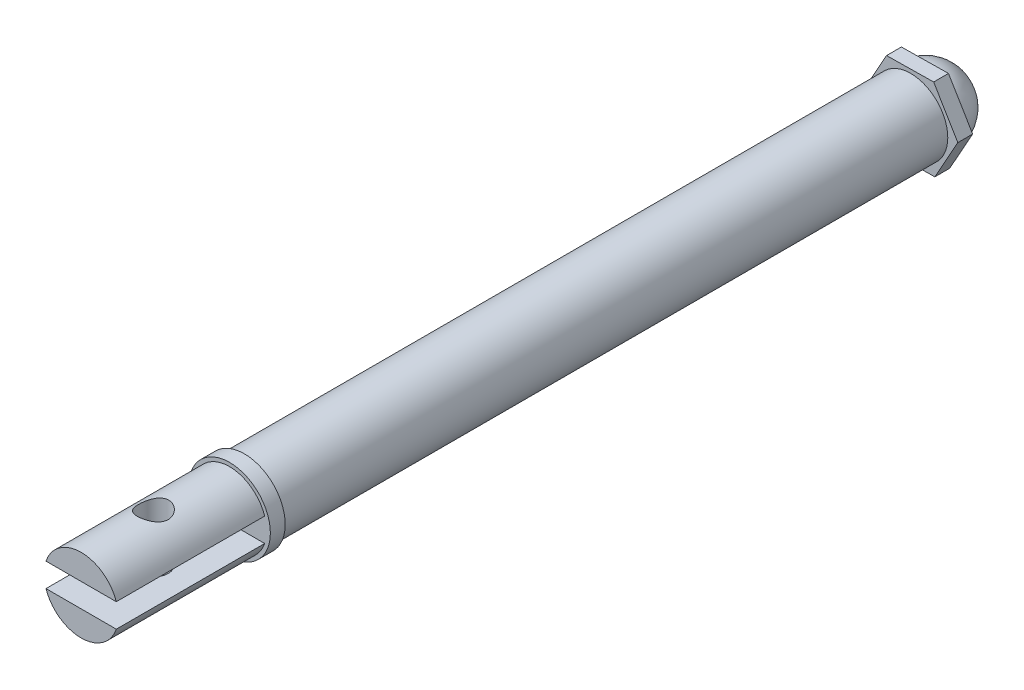
ISO-10303-21;
HEADER;
FILE_DESCRIPTION(('STEP AP214'),'2;1');
FILE_NAME('part.step','',(''),(''),'','','');
FILE_SCHEMA(('AUTOMOTIVE_DESIGN { 1 0 10303 214 1 1 1 1 }'));
ENDSEC;
DATA;
#1=APPLICATION_CONTEXT('core data for automotive mechanical design processes');
#2=APPLICATION_PROTOCOL_DEFINITION('international standard','automotive_design',2000,#1);
#3=PRODUCT_CONTEXT('',#1,'mechanical');
#4=PRODUCT('Part','Part','',(#3));
#5=PRODUCT_RELATED_PRODUCT_CATEGORY('part','',(#4));
#6=PRODUCT_DEFINITION_FORMATION('','',#4);
#7=PRODUCT_DEFINITION_CONTEXT('part definition',#1,'design');
#8=PRODUCT_DEFINITION('design','',#6,#7);
#9=PRODUCT_DEFINITION_SHAPE('','',#8);
#10=(LENGTH_UNIT() NAMED_UNIT(*) SI_UNIT(.MILLI.,.METRE.));
#11=(NAMED_UNIT(*) PLANE_ANGLE_UNIT() SI_UNIT($,.RADIAN.));
#12=(NAMED_UNIT(*) SI_UNIT($,.STERADIAN.) SOLID_ANGLE_UNIT());
#13=UNCERTAINTY_MEASURE_WITH_UNIT(LENGTH_MEASURE(1.E-05),#10,'distance_accuracy_value','');
#14=(GEOMETRIC_REPRESENTATION_CONTEXT(3) GLOBAL_UNCERTAINTY_ASSIGNED_CONTEXT((#13)) GLOBAL_UNIT_ASSIGNED_CONTEXT((#10,
#11,#12)) REPRESENTATION_CONTEXT('',''));
#15=CARTESIAN_POINT('',(0.,0.,0.));
#16=DIRECTION('',(0.,0.,1.));
#17=DIRECTION('',(1.,0.,0.));
#18=AXIS2_PLACEMENT_3D('',#15,#16,#17);
#19=CARTESIAN_POINT('',(0.,0.,-59.4));
#20=DIRECTION('',(0.,0.,1.));
#21=DIRECTION('',(1.,0.,0.));
#22=AXIS2_PLACEMENT_3D('',#19,#20,#21);
#23=CYLINDRICAL_SURFACE('',#22,2.5);
#24=CARTESIAN_POINT('',(0.,0.,-55.9));
#25=DIRECTION('',(0.,0.,1.));
#26=DIRECTION('',(1.,0.,0.));
#27=AXIS2_PLACEMENT_3D('',#24,#25,#26);
#28=CIRCLE('',#27,2.5);
#29=CARTESIAN_POINT('',(2.5,0.,-55.9));
#30=VERTEX_POINT('',#29);
#31=EDGE_CURVE('E11',#30,#30,#28,.F.);
#32=ORIENTED_EDGE('',*,*,#31,.F.);
#33=EDGE_LOOP('',(#32));
#34=FACE_BOUND('',#33,.T.);
#35=CARTESIAN_POINT('',(0.,0.,-11.));
#36=DIRECTION('',(0.,0.,1.));
#37=DIRECTION('',(1.,0.,0.));
#38=AXIS2_PLACEMENT_3D('',#35,#36,#37);
#39=CIRCLE('',#38,2.5);
#40=CARTESIAN_POINT('',(2.5,0.,-11.));
#41=VERTEX_POINT('',#40);
#42=EDGE_CURVE('E104',#41,#41,#39,.F.);
#43=ORIENTED_EDGE('',*,*,#42,.T.);
#44=EDGE_LOOP('',(#43));
#45=FACE_BOUND('',#44,.T.);
#46=ADVANCED_FACE('F39',(#34,#45),#23,.T.);
#47=CARTESIAN_POINT('',(0.,0.,-11.));
#48=DIRECTION('',(0.,0.,1.));
#49=DIRECTION('',(1.,0.,0.));
#50=AXIS2_PLACEMENT_3D('',#47,#48,#49);
#51=CYLINDRICAL_SURFACE('',#50,2.75);
#52=CARTESIAN_POINT('',(0.,0.,-11.));
#53=DIRECTION('',(0.,0.,1.));
#54=DIRECTION('',(1.,0.,0.));
#55=AXIS2_PLACEMENT_3D('',#52,#53,#54);
#56=CIRCLE('',#55,2.75);
#57=CARTESIAN_POINT('',(2.75,0.,-11.));
#58=VERTEX_POINT('',#57);
#59=EDGE_CURVE('E116',#58,#58,#56,.T.);
#60=ORIENTED_EDGE('',*,*,#59,.T.);
#61=EDGE_LOOP('',(#60));
#62=FACE_BOUND('',#61,.T.);
#63=CARTESIAN_POINT('',(0.,0.,-10.));
#64=DIRECTION('',(0.,0.,1.));
#65=DIRECTION('',(1.,0.,0.));
#66=AXIS2_PLACEMENT_3D('',#63,#64,#65);
#67=CIRCLE('',#66,2.75);
#68=CARTESIAN_POINT('',(2.75,0.,-10.));
#69=VERTEX_POINT('',#68);
#70=EDGE_CURVE('E119',#69,#69,#67,.T.);
#71=ORIENTED_EDGE('',*,*,#70,.F.);
#72=EDGE_LOOP('',(#71));
#73=FACE_BOUND('',#72,.T.);
#74=ADVANCED_FACE('F147',(#62,#73),#51,.T.);
#75=CARTESIAN_POINT('',(0.,0.,-11.));
#76=DIRECTION('',(0.,0.,1.));
#77=DIRECTION('',(1.,0.,0.));
#78=AXIS2_PLACEMENT_3D('',#75,#76,#77);
#79=PLANE('',#78);
#80=ORIENTED_EDGE('',*,*,#42,.F.);
#81=EDGE_LOOP('',(#80));
#82=FACE_BOUND('',#81,.T.);
#83=ORIENTED_EDGE('',*,*,#59,.F.);
#84=EDGE_LOOP('',(#83));
#85=FACE_BOUND('',#84,.T.);
#86=ADVANCED_FACE('F152',(#82,#85),#79,.F.);
#87=CARTESIAN_POINT('',(0.,0.,0.));
#88=DIRECTION('',(0.,0.,1.));
#89=DIRECTION('',(1.,0.,0.));
#90=AXIS2_PLACEMENT_3D('',#87,#88,#89);
#91=PLANE('',#90);
#92=DIRECTION('',(1.,0.,0.));
#93=VECTOR('',#92,1.);
#94=CARTESIAN_POINT('',(-2.3685438564654,-0.8,0.));
#95=LINE('',#94,#93);
#96=CARTESIAN_POINT('',(-2.3685438564654,-0.8,0.));
#97=VERTEX_POINT('',#96);
#98=CARTESIAN_POINT('',(2.3685438564654,-0.800000000000001,0.));
#99=VERTEX_POINT('',#98);
#100=EDGE_CURVE('E93',#97,#99,#95,.T.);
#101=ORIENTED_EDGE('',*,*,#100,.F.);
#102=CARTESIAN_POINT('',(0.,0.,0.));
#103=DIRECTION('',(0.,0.,1.));
#104=DIRECTION('',(1.,0.,0.));
#105=AXIS2_PLACEMENT_3D('',#102,#103,#104);
#106=CIRCLE('',#105,2.5);
#107=EDGE_CURVE('E96',#97,#99,#106,.T.);
#108=ORIENTED_EDGE('',*,*,#107,.T.);
#109=EDGE_LOOP('',(#101,#108));
#110=FACE_BOUND('',#109,.T.);
#111=ADVANCED_FACE('F130',(#110),#91,.T.);
#112=DIRECTION('',(-1.,0.,0.));
#113=VECTOR('',#112,1.);
#114=CARTESIAN_POINT('',(-2.3685438564654,0.8,0.));
#115=LINE('',#114,#113);
#116=CARTESIAN_POINT('',(2.3685438564654,0.8,0.));
#117=VERTEX_POINT('',#116);
#118=CARTESIAN_POINT('',(-2.3685438564654,0.8,0.));
#119=VERTEX_POINT('',#118);
#120=EDGE_CURVE('E80',#117,#119,#115,.T.);
#121=ORIENTED_EDGE('',*,*,#120,.F.);
#122=EDGE_CURVE('E91',#117,#119,#106,.T.);
#123=ORIENTED_EDGE('',*,*,#122,.T.);
#124=EDGE_LOOP('',(#121,#123));
#125=FACE_BOUND('',#124,.T.);
#126=ADVANCED_FACE('F90',(#125),#91,.T.);
#127=CARTESIAN_POINT('',(-0.131456143534598,2.49654146417139,-4.));
#128=CARTESIAN_POINT('',(-0.0782893438461265,2.49933699497716,-4.00000536914569));
#129=CARTESIAN_POINT('',(-0.0249465968572458,2.50042717735922,-4.00426458029996));
#130=CARTESIAN_POINT('',(0.0804252499928726,2.49926503239982,-4.02124124028142));
#131=CARTESIAN_POINT('',(0.132450690421456,2.49700425323676,-4.03398003168878));
#132=CARTESIAN_POINT('',(0.233483976108499,2.489586951473,-4.06745431533922));
#133=CARTESIAN_POINT('',(0.282499566061663,2.48443823884426,-4.08816819300919));
#134=CARTESIAN_POINT('',(0.376390450112355,2.47195802701406,-4.13692884841106));
#135=CARTESIAN_POINT('',(0.421267054137366,2.46462722153905,-4.16497329527875));
#136=CARTESIAN_POINT('',(0.507337326959463,2.44838571580914,-4.22869821696534));
#137=CARTESIAN_POINT('',(0.548354408218022,2.4394298554574,-4.26460546345164));
#138=CARTESIAN_POINT('',(0.624005626807999,2.42118450396301,-4.34255809138979));
#139=CARTESIAN_POINT('',(0.658637058872687,2.41189487340153,-4.38460606088955));
#140=CARTESIAN_POINT('',(0.722148446839583,2.3936679346809,-4.47598008620173));
#141=CARTESIAN_POINT('',(0.750682556849087,2.38476757394769,-4.52555496771732));
#142=CARTESIAN_POINT('',(0.798976289549772,2.36902643285563,-4.62911321142982));
#143=CARTESIAN_POINT('',(0.81873830937045,2.36218508999831,-4.68309536448173));
#144=CARTESIAN_POINT('',(0.84837641480648,2.35170168441568,-4.79250211178498));
#145=CARTESIAN_POINT('',(0.858495595347256,2.34798125141428,-4.84785298870982));
#146=CARTESIAN_POINT('',(0.869300210874398,2.34400357913074,-4.95958198523669));
#147=CARTESIAN_POINT('',(0.869989297535566,2.34374499929419,-5.01595969874135));
#148=CARTESIAN_POINT('',(0.862133309177121,2.34664429198024,-5.12491122020865));
#149=CARTESIAN_POINT('',(0.854082609470049,2.34961926616717,-5.17752660198039));
#150=CARTESIAN_POINT('',(0.829826967515634,2.35829412984622,-5.28060507115014));
#151=CARTESIAN_POINT('',(0.813620875057577,2.36399440370029,-5.33106785386309));
#152=CARTESIAN_POINT('',(0.773306554214959,2.37748862807647,-5.42925681227927));
#153=CARTESIAN_POINT('',(0.74909101688588,2.38531073527962,-5.4769348652949));
#154=CARTESIAN_POINT('',(0.693496692871793,2.40206231248891,-5.56770371430814));
#155=CARTESIAN_POINT('',(0.662115587759639,2.41099214047126,-5.61079301898006));
#156=CARTESIAN_POINT('',(0.590925913224237,2.42945111743436,-5.69377334321714));
#157=CARTESIAN_POINT('',(0.550735818987069,2.43898514081671,-5.73333681190776));
#158=CARTESIAN_POINT('',(0.464128096391489,2.45693675734536,-5.80526254348717));
#159=CARTESIAN_POINT('',(0.417710047360756,2.46535427499991,-5.83762431953881));
#160=CARTESIAN_POINT('',(0.31956645380098,2.47998933118605,-5.89431749369222));
#161=CARTESIAN_POINT('',(0.267816671344357,2.48619619492506,-5.9186098894442));
#162=CARTESIAN_POINT('',(0.160686239830986,2.49540849260229,-5.95807469436584));
#163=CARTESIAN_POINT('',(0.105307356814108,2.49841547160764,-5.97325150346106));
#164=CARTESIAN_POINT('',(-0.0041014119712082,2.50056116221719,-5.99332631883865));
#165=CARTESIAN_POINT('',(-0.0580294236032281,2.49990976996206,-5.99875890548325));
#166=CARTESIAN_POINT('',(-0.165890664046472,2.4950736929613,-6.00086096057145));
#167=CARTESIAN_POINT('',(-0.219823890739632,2.49088955810807,-5.99753179266353));
#168=CARTESIAN_POINT('',(-0.324517111462718,2.47939163617017,-5.98256928300398));
#169=CARTESIAN_POINT('',(-0.37532377978496,2.47217400806549,-5.9711842974448));
#170=CARTESIAN_POINT('',(-0.474163538214975,2.45513471958837,-5.94086427247601));
#171=CARTESIAN_POINT('',(-0.52219612087232,2.44531258461154,-5.92192785669523));
#172=CARTESIAN_POINT('',(-0.616556889617534,2.42328540381697,-5.87610122786888));
#173=CARTESIAN_POINT('',(-0.662706451115579,2.41099187062067,-5.84888664821404));
#174=CARTESIAN_POINT('',(-0.749901227631086,2.38531291006781,-5.78763420679123));
#175=CARTESIAN_POINT('',(-0.790943987014164,2.3719269625012,-5.75359308283101));
#176=CARTESIAN_POINT('',(-0.869890677859329,2.34417702758644,-5.6767312992679));
#177=CARTESIAN_POINT('',(-0.907350002527235,2.32981263128045,-5.63345249881966));
#178=CARTESIAN_POINT('',(-0.974532239035233,2.30252147079278,-5.54082867980776));
#179=CARTESIAN_POINT('',(-1.00425398767912,2.28959492293115,-5.49148275080737));
#180=CARTESIAN_POINT('',(-1.05496959809875,2.26667528624498,-5.38787253729648));
#181=CARTESIAN_POINT('',(-1.07596917793187,2.25668027683699,-5.33361150353303));
#182=CARTESIAN_POINT('',(-1.10830195703982,2.24098129257036,-5.22170839887344));
#183=CARTESIAN_POINT('',(-1.1196453208486,2.23527280628788,-5.16406995168737));
#184=CARTESIAN_POINT('',(-1.13145455328091,2.22931565944756,-5.05305101094778));
#185=CARTESIAN_POINT('',(-1.13286279625652,2.22859412309508,-4.9997950498309));
#186=CARTESIAN_POINT('',(-1.12721995608642,2.23145362917508,-4.89385584110966));
#187=CARTESIAN_POINT('',(-1.12016995362385,2.23503412195104,-4.84117252120849));
#188=CARTESIAN_POINT('',(-1.0985172527872,2.24575017727613,-4.74055605828248));
#189=CARTESIAN_POINT('',(-1.08430717650327,2.25270028502682,-4.69251695453523));
#190=CARTESIAN_POINT('',(-1.04910180374787,2.26930879526565,-4.59949849634583));
#191=CARTESIAN_POINT('',(-1.02810453890458,2.2789679833142,-4.55452003411533));
#192=CARTESIAN_POINT('',(-0.978191082224807,2.30085528407787,-4.46536399884842));
#193=CARTESIAN_POINT('',(-0.948812295803576,2.31321859423867,-4.42147916884155));
#194=CARTESIAN_POINT('',(-0.883694268633124,2.33886907591134,-4.3390153627511));
#195=CARTESIAN_POINT('',(-0.847952481413776,2.35215661599764,-4.30043852192127));
#196=CARTESIAN_POINT('',(-0.767369735476709,2.37972957842794,-4.22612697932987));
#197=CARTESIAN_POINT('',(-0.72200064061745,2.39399784355386,-4.1909558791411));
#198=CARTESIAN_POINT('',(-0.625547629232276,2.42099059451182,-4.12869749493818));
#199=CARTESIAN_POINT('',(-0.57446031261542,2.43371415237808,-4.10161505597511));
#200=CARTESIAN_POINT('',(-0.468104287801799,2.45638391508748,-4.05660799570401));
#201=CARTESIAN_POINT('',(-0.412855911982356,2.46634263622834,-4.03864178900177));
#202=CARTESIAN_POINT('',(-0.299681009498886,2.48262607312379,-4.01255401223183));
#203=CARTESIAN_POINT('',(-0.241763935453186,2.48896268796647,-4.00440010875516));
#204=CARTESIAN_POINT('',(-0.166201646999307,2.49453126323459,-4.00045117104555));
#205=CARTESIAN_POINT('',(-0.14883829853487,2.49562750376642,-3.99999824463155));
#206=CARTESIAN_POINT('',(-0.131456143534598,2.49654146417139,-4.));
#207=B_SPLINE_CURVE_WITH_KNOTS('',3,(#127,#128,#129,#130,#131,#132,#133,#134,#135,#136,#137,
#138,#139,#140,#141,#142,#143,#144,#145,#146,#147,#148,#149,#150,#151,#152,#153,#154,#155,#156,
#157,#158,#159,#160,#161,#162,#163,#164,#165,#166,#167,#168,#169,#170,#171,#172,#173,#174,#175,
#176,#177,#178,#179,#180,#181,#182,#183,#184,#185,#186,#187,#188,#189,#190,#191,#192,#193,#194,
#195,#196,#197,#198,#199,#200,#201,#202,#203,#204,#205,#206),.UNSPECIFIED.,.T.,.F.,(4,2,2,2,2,2,
2,2,2,2,2,2,2,2,2,2,2,2,2,2,2,2,2,2,2,2,2,2,2,2,2,2,2,2,2,2,2,2,2,4),(0.,0.159672562889257,
0.319748539077892,0.479393687233931,0.638988135443401,0.80399671203524,0.969075034347958,
1.14189417290998,1.31466605645467,1.48295718630807,1.65118314587964,1.8103664103346,
1.96957213178681,2.13100364346718,2.29248746068297,2.46328005794335,2.63408419734318,
2.80570227617693,2.97723745141926,3.13903527556025,3.30080791954959,3.45779902455279,
3.61481875683002,3.77902505687176,3.94331001376666,4.11952930423185,4.29577507061122,
4.47190511116849,4.64784951985953,4.80684913791565,4.96582844325888,5.1169095790978,
5.26803456977647,5.43008017091328,5.59219076901102,5.76881392395292,5.94554266371349,
6.12145780658494,6.29679167416501,6.34899442576364),.UNSPECIFIED.);
#208=CARTESIAN_POINT('',(-0.131456143534598,2.49654146417139,-4.));
#209=VERTEX_POINT('',#208);
#210=EDGE_CURVE('E166',#209,#209,#207,.T.);
#211=ORIENTED_EDGE('',*,*,#210,.F.);
#212=EDGE_LOOP('',(#211));
#213=FACE_BOUND('',#212,.T.);
#214=CARTESIAN_POINT('',(0.,0.,-10.));
#215=DIRECTION('',(0.,0.,1.));
#216=DIRECTION('',(1.,0.,0.));
#217=AXIS2_PLACEMENT_3D('',#214,#215,#216);
#218=CIRCLE('',#217,2.5);
#219=CARTESIAN_POINT('',(-2.3685438564654,0.8,-10.));
#220=VERTEX_POINT('',#219);
#221=CARTESIAN_POINT('',(2.3685438564654,0.8,-10.));
#222=VERTEX_POINT('',#221);
#223=EDGE_CURVE('E63',#220,#222,#218,.F.);
#224=ORIENTED_EDGE('',*,*,#223,.F.);
#225=DIRECTION('',(0.,0.,1.));
#226=VECTOR('',#225,1.);
#227=CARTESIAN_POINT('',(-2.3685438564654,0.8,-10.));
#228=LINE('',#227,#226);
#229=EDGE_CURVE('E85',#220,#119,#228,.T.);
#230=ORIENTED_EDGE('',*,*,#229,.T.);
#231=ORIENTED_EDGE('',*,*,#122,.F.);
#232=DIRECTION('',(0.,0.,1.));
#233=VECTOR('',#232,1.);
#234=CARTESIAN_POINT('',(2.3685438564654,0.8,-10.));
#235=LINE('',#234,#233);
#236=EDGE_CURVE('E76',#222,#117,#235,.T.);
#237=ORIENTED_EDGE('',*,*,#236,.F.);
#238=EDGE_LOOP('',(#224,#230,#231,#237));
#239=FACE_BOUND('',#238,.T.);
#240=ADVANCED_FACE('F95',(#213,#239),#23,.T.);
#241=CARTESIAN_POINT('',(-2.3685438564654,0.8,-10.));
#242=DIRECTION('',(0.,1.,0.));
#243=DIRECTION('',(0.,0.,1.));
#244=AXIS2_PLACEMENT_3D('',#241,#242,#243);
#245=PLANE('',#244);
#246=CARTESIAN_POINT('',(-0.131456143534598,0.8,-5.));
#247=DIRECTION('',(0.,1.,0.));
#248=DIRECTION('',(0.,0.,1.));
#249=AXIS2_PLACEMENT_3D('',#246,#247,#248);
#250=CIRCLE('',#249,1.);
#251=CARTESIAN_POINT('',(-0.131456143534598,0.8,-4.));
#252=VERTEX_POINT('',#251);
#253=EDGE_CURVE('E169',#252,#252,#250,.T.);
#254=ORIENTED_EDGE('',*,*,#253,.T.);
#255=EDGE_LOOP('',(#254));
#256=FACE_BOUND('',#255,.T.);
#257=ORIENTED_EDGE('',*,*,#120,.T.);
#258=ORIENTED_EDGE('',*,*,#229,.F.);
#259=DIRECTION('',(-1.,0.,0.));
#260=VECTOR('',#259,1.);
#261=CARTESIAN_POINT('',(-2.3685438564654,0.8,-10.));
#262=LINE('',#261,#260);
#263=EDGE_CURVE('E82',#222,#220,#262,.T.);
#264=ORIENTED_EDGE('',*,*,#263,.F.);
#265=ORIENTED_EDGE('',*,*,#236,.T.);
#266=EDGE_LOOP('',(#257,#258,#264,#265));
#267=FACE_BOUND('',#266,.T.);
#268=ADVANCED_FACE('F78',(#256,#267),#245,.F.);
#269=CARTESIAN_POINT('',(-0.131456143534598,-2.49654146417139,-4.));
#270=CARTESIAN_POINT('',(-0.186023441991933,-2.49367005116784,-3.99999751015402));
#271=CARTESIAN_POINT('',(-0.240477975299467,-2.48899128651181,-4.00448057651922));
#272=CARTESIAN_POINT('',(-0.347548562232037,-2.47631079809988,-4.02212115542049));
#273=CARTESIAN_POINT('',(-0.400164843459062,-2.46830948731494,-4.03527759003245));
#274=CARTESIAN_POINT('',(-0.502012017156937,-2.44962472433605,-4.06963908385224));
#275=CARTESIAN_POINT('',(-0.55125143677316,-2.43894837057754,-4.09082291677769));
#276=CARTESIAN_POINT('',(-0.645397844372319,-2.41574322620066,-4.1405235764257));
#277=CARTESIAN_POINT('',(-0.69030356809934,-2.40321389770299,-4.16904253416223));
#278=CARTESIAN_POINT('',(-0.777086453484404,-2.37661579314088,-4.23432320827611));
#279=CARTESIAN_POINT('',(-0.818685487712006,-2.36250086929009,-4.27143589563926));
#280=CARTESIAN_POINT('',(-0.895224705799574,-2.33457394945875,-4.3521175645812));
#281=CARTESIAN_POINT('',(-0.930161902345053,-2.3207620918249,-4.39568942710279));
#282=CARTESIAN_POINT('',(-0.993746598245446,-2.29427616191986,-4.49026548163416));
#283=CARTESIAN_POINT('',(-1.02208551082255,-2.28166997151426,-4.54149772857673));
#284=CARTESIAN_POINT('',(-1.06955746117707,-2.25980882632437,-4.64872199802627));
#285=CARTESIAN_POINT('',(-1.08869743172586,-2.25055134909221,-4.70471039849625));
#286=CARTESIAN_POINT('',(-1.11588355438555,-2.23719011914772,-4.81576956697768));
#287=CARTESIAN_POINT('',(-1.12460482443568,-2.23277448124708,-4.87063647010867));
#288=CARTESIAN_POINT('',(-1.13281326839032,-2.22862255895315,-4.98121969467737));
#289=CARTESIAN_POINT('',(-1.13230591772901,-2.22888349989689,-5.03693549285024));
#290=CARTESIAN_POINT('',(-1.12255062281478,-2.23380887411281,-5.14245408654609));
#291=CARTESIAN_POINT('',(-1.1140687085059,-2.23808734254574,-5.19234884517273));
#292=CARTESIAN_POINT('',(-1.08982811040944,-2.24999006500428,-5.28991565444004));
#293=CARTESIAN_POINT('',(-1.07406786859029,-2.25761503537981,-5.33758722676864));
#294=CARTESIAN_POINT('',(-1.0352706680075,-2.27567197933972,-5.4309909141562));
#295=CARTESIAN_POINT('',(-1.0120324599773,-2.2861802358447,-5.47662410318849));
#296=CARTESIAN_POINT('',(-0.959118389451096,-2.3088784501579,-5.56353022002977));
#297=CARTESIAN_POINT('',(-0.929439806243561,-2.32106911789952,-5.60480129408943));
#298=CARTESIAN_POINT('',(-0.861027968096325,-2.34736069189323,-5.68616727667158));
#299=CARTESIAN_POINT('',(-0.821684988789998,-2.36153053684548,-5.72572868949389));
#300=CARTESIAN_POINT('',(-0.736862263490702,-2.38935679736989,-5.79786247536955));
#301=CARTESIAN_POINT('',(-0.691380418992679,-2.40301303532089,-5.83043244856882));
#302=CARTESIAN_POINT('',(-0.593429086127987,-2.42909496735717,-5.88879131502311));
#303=CARTESIAN_POINT('',(-0.540760764800832,-2.44145483398515,-5.91427816197797));
#304=CARTESIAN_POINT('',(-0.431241161587078,-2.46315649239414,-5.95579988135299));
#305=CARTESIAN_POINT('',(-0.374392052113901,-2.47249983819848,-5.9718396241671));
#306=CARTESIAN_POINT('',(-0.261753698262956,-2.4868681445696,-5.99302915386812));
#307=CARTESIAN_POINT('',(-0.206105594405534,-2.49211861416469,-5.99877471269494));
#308=CARTESIAN_POINT('',(-0.0944121045724995,-2.49884212657288,-6.00087171486808));
#309=CARTESIAN_POINT('',(-0.0383668758772939,-2.50031658925711,-5.99722669033845));
#310=CARTESIAN_POINT('',(0.0689485557628842,-2.49959092655245,-5.98112421120362));
#311=CARTESIAN_POINT('',(0.120303132249248,-2.49760661972251,-5.96921034727638));
#312=CARTESIAN_POINT('',(0.220330529806314,-2.49077675657075,-5.93754928292724));
#313=CARTESIAN_POINT('',(0.269003165815822,-2.48593100307096,-5.91780154271554));
#314=CARTESIAN_POINT('',(0.363151197913487,-2.47394615717132,-5.87073315001496));
#315=CARTESIAN_POINT('',(0.408567102017278,-2.46677348697411,-5.84330247616965));
#316=CARTESIAN_POINT('',(0.494352778933947,-2.45102436274804,-5.78176224787298));
#317=CARTESIAN_POINT('',(0.53472086341032,-2.44244744124468,-5.74765046854042));
#318=CARTESIAN_POINT('',(0.611765187069995,-2.42433538409947,-5.67136537053751));
#319=CARTESIAN_POINT('',(0.648081837270648,-2.41477357822371,-5.62883456916154));
#320=CARTESIAN_POINT('',(0.713198030565137,-2.39635073139855,-5.53821292092029));
#321=CARTESIAN_POINT('',(0.741996249155843,-2.38748981411432,-5.49012109653393));
#322=CARTESIAN_POINT('',(0.791696668755843,-2.37147923126637,-5.38863409146103));
#323=CARTESIAN_POINT('',(0.812447860354469,-2.3643631370074,-5.33515921202176));
#324=CARTESIAN_POINT('',(0.84454456163565,-2.35309127487983,-5.22516739976549));
#325=CARTESIAN_POINT('',(0.855894856308436,-2.34893400114426,-5.16865203015641));
#326=CARTESIAN_POINT('',(0.868388553291361,-2.34434277273146,-5.05731695891033));
#327=CARTESIAN_POINT('',(0.870028465769489,-2.34372774359679,-5.00256026171734));
#328=CARTESIAN_POINT('',(0.864360813136205,-2.34582381590722,-4.89358188009585));
#329=CARTESIAN_POINT('',(0.857054203079368,-2.3485345623209,-4.83936013918282));
#330=CARTESIAN_POINT('',(0.83414697919063,-2.35676446448375,-4.73467841682979));
#331=CARTESIAN_POINT('',(0.818805361259226,-2.36219570345777,-4.68415418184772));
#332=CARTESIAN_POINT('',(0.78050155198315,-2.37512605018772,-4.58636679119382));
#333=CARTESIAN_POINT('',(0.757537494008011,-2.38262566438406,-4.53910443773964));
#334=CARTESIAN_POINT('',(0.703436058640113,-2.39916872475249,-4.44688221272131));
#335=CARTESIAN_POINT('',(0.671979521383171,-2.40826615202457,-4.40211937326373));
#336=CARTESIAN_POINT('',(0.60222453967951,-2.42664894651425,-4.31832080669071));
#337=CARTESIAN_POINT('',(0.563924340194136,-2.43593436139789,-4.27928655334342));
#338=CARTESIAN_POINT('',(0.479540465815855,-2.45397200198032,-4.20632103573168));
#339=CARTESIAN_POINT('',(0.433190181277172,-2.46268331211946,-4.17268657398959));
#340=CARTESIAN_POINT('',(0.335152818212584,-2.47792890042923,-4.11368787358256));
#341=CARTESIAN_POINT('',(0.283465261508479,-2.48446298331513,-4.08832437677986));
#342=CARTESIAN_POINT('',(0.172538507537175,-2.49470090262663,-4.0453491312691));
#343=CARTESIAN_POINT('',(0.113024650566774,-2.49818095684361,-4.02838513161419));
#344=CARTESIAN_POINT('',(-0.00819332973742269,-2.50071996265291,-4.0057144024561));
#345=CARTESIAN_POINT('',(-0.0698964949561367,-2.49978082511501,-4.00000280889925));
#346=CARTESIAN_POINT('',(-0.131456143534598,-2.49654146417139,-4.));
#347=B_SPLINE_CURVE_WITH_KNOTS('',3,(#269,#270,#271,#272,#273,#274,#275,#276,#277,#278,#279,
#280,#281,#282,#283,#284,#285,#286,#287,#288,#289,#290,#291,#292,#293,#294,#295,#296,#297,#298,
#299,#300,#301,#302,#303,#304,#305,#306,#307,#308,#309,#310,#311,#312,#313,#314,#315,#316,#317,
#318,#319,#320,#321,#322,#323,#324,#325,#326,#327,#328,#329,#330,#331,#332,#333,#334,#335,#336,
#337,#338,#339,#340,#341,#342,#343,#344,#345,#346),.UNSPECIFIED.,.T.,.F.,(4,2,2,2,2,2,2,2,2,2,2,
2,2,2,2,2,2,2,2,2,2,2,2,2,2,2,2,2,2,2,2,2,2,2,2,2,2,2,4),(0.,0.163694174500923,
0.327368008963661,0.49061203857719,0.653903547822555,0.825669600840229,0.997512497323652,
1.17624989545256,1.35485237630449,1.52111501523561,1.68727901207796,1.83895365200038,
1.99066077514001,2.14685046513952,2.30310626576371,2.47504006808729,2.64703279369181,
2.82551165985032,3.00389843165029,3.17157965595347,3.33919781874238,3.49672767510486,
3.65426838787882,3.81419187372333,3.97416870666614,4.14360778400351,4.31307669088429,
4.4855875084135,4.65801046509855,4.82153534073885,4.98504276137748,5.143577578454,
5.30215124719894,5.46780530315717,5.63350190177882,5.80642500764306,5.97936361954078,
6.16411373411636,6.34878396961459),.UNSPECIFIED.);
#348=CARTESIAN_POINT('',(-0.131456143534598,-2.49654146417139,-4.));
#349=VERTEX_POINT('',#348);
#350=EDGE_CURVE('E175',#349,#349,#347,.T.);
#351=ORIENTED_EDGE('',*,*,#350,.F.);
#352=EDGE_LOOP('',(#351));
#353=FACE_BOUND('',#352,.T.);
#354=CARTESIAN_POINT('',(2.3685438564654,-0.8,-10.));
#355=VERTEX_POINT('',#354);
#356=CARTESIAN_POINT('',(-2.3685438564654,-0.8,-10.));
#357=VERTEX_POINT('',#356);
#358=EDGE_CURVE('E106',#355,#357,#218,.F.);
#359=ORIENTED_EDGE('',*,*,#358,.F.);
#360=DIRECTION('',(0.,0.,1.));
#361=VECTOR('',#360,1.);
#362=CARTESIAN_POINT('',(2.3685438564654,-0.800000000000001,-10.));
#363=LINE('',#362,#361);
#364=EDGE_CURVE('E86',#355,#99,#363,.T.);
#365=ORIENTED_EDGE('',*,*,#364,.T.);
#366=ORIENTED_EDGE('',*,*,#107,.F.);
#367=DIRECTION('',(0.,0.,1.));
#368=VECTOR('',#367,1.);
#369=CARTESIAN_POINT('',(-2.3685438564654,-0.8,-10.));
#370=LINE('',#369,#368);
#371=EDGE_CURVE('E55',#357,#97,#370,.T.);
#372=ORIENTED_EDGE('',*,*,#371,.F.);
#373=EDGE_LOOP('',(#359,#365,#366,#372));
#374=FACE_BOUND('',#373,.T.);
#375=ADVANCED_FACE('F127',(#353,#374),#23,.T.);
#376=CARTESIAN_POINT('',(-2.3685438564654,-0.8,-10.));
#377=DIRECTION('',(0.,-1.,0.));
#378=DIRECTION('',(0.,0.,-1.));
#379=AXIS2_PLACEMENT_3D('',#376,#377,#378);
#380=PLANE('',#379);
#381=CARTESIAN_POINT('',(-0.131456143534598,-0.8,-5.));
#382=DIRECTION('',(0.,-1.,0.));
#383=DIRECTION('',(0.,0.,-1.));
#384=AXIS2_PLACEMENT_3D('',#381,#382,#383);
#385=CIRCLE('',#384,1.);
#386=CARTESIAN_POINT('',(-0.131456143534598,-0.8,-6.));
#387=VERTEX_POINT('',#386);
#388=EDGE_CURVE('E43',#387,#387,#385,.T.);
#389=ORIENTED_EDGE('',*,*,#388,.T.);
#390=EDGE_LOOP('',(#389));
#391=FACE_BOUND('',#390,.T.);
#392=ORIENTED_EDGE('',*,*,#100,.T.);
#393=ORIENTED_EDGE('',*,*,#364,.F.);
#394=DIRECTION('',(1.,0.,0.));
#395=VECTOR('',#394,1.);
#396=CARTESIAN_POINT('',(-2.3685438564654,-0.8,-10.));
#397=LINE('',#396,#395);
#398=EDGE_CURVE('E92',#357,#355,#397,.T.);
#399=ORIENTED_EDGE('',*,*,#398,.F.);
#400=ORIENTED_EDGE('',*,*,#371,.T.);
#401=EDGE_LOOP('',(#392,#393,#399,#400));
#402=FACE_BOUND('',#401,.T.);
#403=ADVANCED_FACE('F131',(#391,#402),#380,.F.);
#404=CARTESIAN_POINT('',(0.,0.,-10.));
#405=DIRECTION('',(0.,0.,1.));
#406=DIRECTION('',(1.,0.,0.));
#407=AXIS2_PLACEMENT_3D('',#404,#405,#406);
#408=PLANE('',#407);
#409=ORIENTED_EDGE('',*,*,#358,.T.);
#410=ORIENTED_EDGE('',*,*,#398,.T.);
#411=EDGE_LOOP('',(#409,#410));
#412=FACE_BOUND('',#411,.T.);
#413=ORIENTED_EDGE('',*,*,#263,.T.);
#414=ORIENTED_EDGE('',*,*,#223,.T.);
#415=EDGE_LOOP('',(#413,#414));
#416=FACE_BOUND('',#415,.T.);
#417=ORIENTED_EDGE('',*,*,#70,.T.);
#418=EDGE_LOOP('',(#417));
#419=FACE_BOUND('',#418,.T.);
#420=ADVANCED_FACE('F133',(#412,#416,#419),#408,.T.);
#421=CARTESIAN_POINT('',(3.17509448342702,0.0459168231112042,-55.9));
#422=DIRECTION('',(-0.858704834520937,-0.512470493950989,0.));
#423=DIRECTION('',(0.512470493950989,-0.858704834520937,0.));
#424=AXIS2_PLACEMENT_3D('',#421,#422,#423);
#425=PLANE('',#424);
#426=DIRECTION('',(-0.512470493950989,0.858704834520937,0.));
#427=VECTOR('',#426,1.);
#428=CARTESIAN_POINT('',(3.17509448342702,0.0459168231112042,-56.9));
#429=LINE('',#428,#427);
#430=CARTESIAN_POINT('',(3.17509448342702,0.0459168231112042,-56.9));
#431=VERTEX_POINT('',#430);
#432=CARTESIAN_POINT('',(1.54778210643813,2.77267089361923,-56.9));
#433=VERTEX_POINT('',#432);
#434=EDGE_CURVE('E168',#431,#433,#429,.T.);
#435=ORIENTED_EDGE('',*,*,#434,.T.);
#436=DIRECTION('',(0.,0.,-1.));
#437=VECTOR('',#436,1.);
#438=CARTESIAN_POINT('',(1.54778210643813,2.77267089361923,-55.9));
#439=LINE('',#438,#437);
#440=CARTESIAN_POINT('',(1.54778210643813,2.77267089361923,-55.9));
#441=VERTEX_POINT('',#440);
#442=EDGE_CURVE('E231',#441,#433,#439,.T.);
#443=ORIENTED_EDGE('',*,*,#442,.F.);
#444=DIRECTION('',(-0.512470493950989,0.858704834520937,0.));
#445=VECTOR('',#444,1.);
#446=CARTESIAN_POINT('',(3.17509448342702,0.0459168231112042,-55.9));
#447=LINE('',#446,#445);
#448=CARTESIAN_POINT('',(3.17509448342702,0.0459168231112042,-55.9));
#449=VERTEX_POINT('',#448);
#450=EDGE_CURVE('E183',#449,#441,#447,.T.);
#451=ORIENTED_EDGE('',*,*,#450,.F.);
#452=DIRECTION('',(0.,0.,-1.));
#453=VECTOR('',#452,1.);
#454=CARTESIAN_POINT('',(3.17509448342702,0.0459168231112042,-55.9));
#455=LINE('',#454,#453);
#456=EDGE_CURVE('E233',#449,#431,#455,.T.);
#457=ORIENTED_EDGE('',*,*,#456,.T.);
#458=EDGE_LOOP('',(#435,#443,#451,#457));
#459=FACE_BOUND('',#458,.T.);
#460=ADVANCED_FACE('F140',(#459),#425,.F.);
#461=CARTESIAN_POINT('',(1.54778210643813,2.77267089361923,-55.9));
#462=DIRECTION('',(0.0144600491910467,-0.999895448023138,0.));
#463=DIRECTION('',(0.999895448023138,0.0144600491910467,0.));
#464=AXIS2_PLACEMENT_3D('',#461,#462,#463);
#465=PLANE('',#464);
#466=DIRECTION('',(-0.999895448023138,-0.0144600491910467,0.));
#467=VECTOR('',#466,1.);
#468=CARTESIAN_POINT('',(1.54778210643813,2.77267089361923,-56.9));
#469=LINE('',#468,#467);
#470=CARTESIAN_POINT('',(-1.62731237698889,2.72675407050803,-56.9));
#471=VERTEX_POINT('',#470);
#472=EDGE_CURVE('E172',#433,#471,#469,.T.);
#473=ORIENTED_EDGE('',*,*,#472,.T.);
#474=DIRECTION('',(0.,0.,-1.));
#475=VECTOR('',#474,1.);
#476=CARTESIAN_POINT('',(-1.62731237698889,2.72675407050803,-55.9));
#477=LINE('',#476,#475);
#478=CARTESIAN_POINT('',(-1.62731237698889,2.72675407050803,-55.9));
#479=VERTEX_POINT('',#478);
#480=EDGE_CURVE('E254',#479,#471,#477,.T.);
#481=ORIENTED_EDGE('',*,*,#480,.F.);
#482=DIRECTION('',(-0.999895448023138,-0.0144600491910467,0.));
#483=VECTOR('',#482,1.);
#484=CARTESIAN_POINT('',(1.54778210643813,2.77267089361923,-55.9));
#485=LINE('',#484,#483);
#486=EDGE_CURVE('E290',#441,#479,#485,.T.);
#487=ORIENTED_EDGE('',*,*,#486,.F.);
#488=ORIENTED_EDGE('',*,*,#442,.T.);
#489=EDGE_LOOP('',(#473,#481,#487,#488));
#490=FACE_BOUND('',#489,.T.);
#491=ADVANCED_FACE('F332',(#490),#465,.F.);
#492=CARTESIAN_POINT('',(-1.62731237698889,2.72675407050803,-55.9));
#493=DIRECTION('',(0.873164883711984,-0.48742495407215,0.));
#494=DIRECTION('',(0.48742495407215,0.873164883711984,0.));
#495=AXIS2_PLACEMENT_3D('',#492,#493,#494);
#496=PLANE('',#495);
#497=DIRECTION('',(-0.48742495407215,-0.873164883711984,0.));
#498=VECTOR('',#497,1.);
#499=CARTESIAN_POINT('',(-1.62731237698889,2.72675407050803,-56.9));
#500=LINE('',#499,#498);
#501=CARTESIAN_POINT('',(-3.17509448342702,-0.0459168231112044,-56.9));
#502=VERTEX_POINT('',#501);
#503=EDGE_CURVE('E277',#471,#502,#500,.T.);
#504=ORIENTED_EDGE('',*,*,#503,.T.);
#505=DIRECTION('',(0.,0.,-1.));
#506=VECTOR('',#505,1.);
#507=CARTESIAN_POINT('',(-3.17509448342702,-0.0459168231112044,-55.9));
#508=LINE('',#507,#506);
#509=CARTESIAN_POINT('',(-3.17509448342702,-0.0459168231112044,-55.9));
#510=VERTEX_POINT('',#509);
#511=EDGE_CURVE('E259',#510,#502,#508,.T.);
#512=ORIENTED_EDGE('',*,*,#511,.F.);
#513=DIRECTION('',(-0.48742495407215,-0.873164883711984,0.));
#514=VECTOR('',#513,1.);
#515=CARTESIAN_POINT('',(-1.62731237698889,2.72675407050803,-55.9));
#516=LINE('',#515,#514);
#517=EDGE_CURVE('E288',#479,#510,#516,.T.);
#518=ORIENTED_EDGE('',*,*,#517,.F.);
#519=ORIENTED_EDGE('',*,*,#480,.T.);
#520=EDGE_LOOP('',(#504,#512,#518,#519));
#521=FACE_BOUND('',#520,.T.);
#522=ADVANCED_FACE('F311',(#521),#496,.F.);
#523=CARTESIAN_POINT('',(-3.17509448342702,-0.0459168231112044,-55.9));
#524=DIRECTION('',(0.858704834520937,0.512470493950988,0.));
#525=DIRECTION('',(-0.512470493950988,0.858704834520937,0.));
#526=AXIS2_PLACEMENT_3D('',#523,#524,#525);
#527=PLANE('',#526);
#528=DIRECTION('',(0.512470493950988,-0.858704834520937,0.));
#529=VECTOR('',#528,1.);
#530=CARTESIAN_POINT('',(-3.17509448342702,-0.0459168231112044,-56.9));
#531=LINE('',#530,#529);
#532=CARTESIAN_POINT('',(-1.54778210643813,-2.77267089361923,-56.9));
#533=VERTEX_POINT('',#532);
#534=EDGE_CURVE('E275',#502,#533,#531,.T.);
#535=ORIENTED_EDGE('',*,*,#534,.T.);
#536=DIRECTION('',(0.,0.,-1.));
#537=VECTOR('',#536,1.);
#538=CARTESIAN_POINT('',(-1.54778210643813,-2.77267089361923,-55.9));
#539=LINE('',#538,#537);
#540=CARTESIAN_POINT('',(-1.54778210643813,-2.77267089361923,-55.9));
#541=VERTEX_POINT('',#540);
#542=EDGE_CURVE('E264',#541,#533,#539,.T.);
#543=ORIENTED_EDGE('',*,*,#542,.F.);
#544=DIRECTION('',(0.512470493950988,-0.858704834520937,0.));
#545=VECTOR('',#544,1.);
#546=CARTESIAN_POINT('',(-3.17509448342702,-0.0459168231112044,-55.9));
#547=LINE('',#546,#545);
#548=EDGE_CURVE('E285',#510,#541,#547,.T.);
#549=ORIENTED_EDGE('',*,*,#548,.F.);
#550=ORIENTED_EDGE('',*,*,#511,.T.);
#551=EDGE_LOOP('',(#535,#543,#549,#550));
#552=FACE_BOUND('',#551,.T.);
#553=ADVANCED_FACE('F314',(#552),#527,.F.);
#554=CARTESIAN_POINT('',(-1.54778210643813,-2.77267089361923,-55.9));
#555=DIRECTION('',(-0.0144600491910469,0.999895448023138,0.));
#556=DIRECTION('',(-0.999895448023138,-0.0144600491910469,0.));
#557=AXIS2_PLACEMENT_3D('',#554,#555,#556);
#558=PLANE('',#557);
#559=DIRECTION('',(0.999895448023138,0.0144600491910469,0.));
#560=VECTOR('',#559,1.);
#561=CARTESIAN_POINT('',(-1.54778210643813,-2.77267089361923,-56.9));
#562=LINE('',#561,#560);
#563=CARTESIAN_POINT('',(1.62731237698889,-2.72675407050803,-56.9));
#564=VERTEX_POINT('',#563);
#565=EDGE_CURVE('E273',#533,#564,#562,.T.);
#566=ORIENTED_EDGE('',*,*,#565,.T.);
#567=DIRECTION('',(0.,0.,-1.));
#568=VECTOR('',#567,1.);
#569=CARTESIAN_POINT('',(1.62731237698889,-2.72675407050803,-55.9));
#570=LINE('',#569,#568);
#571=CARTESIAN_POINT('',(1.62731237698889,-2.72675407050803,-55.9));
#572=VERTEX_POINT('',#571);
#573=EDGE_CURVE('E267',#572,#564,#570,.T.);
#574=ORIENTED_EDGE('',*,*,#573,.F.);
#575=DIRECTION('',(0.999895448023138,0.0144600491910469,0.));
#576=VECTOR('',#575,1.);
#577=CARTESIAN_POINT('',(-1.54778210643813,-2.77267089361923,-55.9));
#578=LINE('',#577,#576);
#579=EDGE_CURVE('E282',#541,#572,#578,.T.);
#580=ORIENTED_EDGE('',*,*,#579,.F.);
#581=ORIENTED_EDGE('',*,*,#542,.T.);
#582=EDGE_LOOP('',(#566,#574,#580,#581));
#583=FACE_BOUND('',#582,.T.);
#584=ADVANCED_FACE('F316',(#583),#558,.F.);
#585=CARTESIAN_POINT('',(1.62731237698889,-2.72675407050803,-55.9));
#586=DIRECTION('',(-0.873164883711984,0.48742495407215,0.));
#587=DIRECTION('',(-0.48742495407215,-0.873164883711984,0.));
#588=AXIS2_PLACEMENT_3D('',#585,#586,#587);
#589=PLANE('',#588);
#590=DIRECTION('',(0.48742495407215,0.873164883711984,0.));
#591=VECTOR('',#590,1.);
#592=CARTESIAN_POINT('',(1.62731237698889,-2.72675407050803,-56.9));
#593=LINE('',#592,#591);
#594=EDGE_CURVE('E220',#564,#431,#593,.T.);
#595=ORIENTED_EDGE('',*,*,#594,.T.);
#596=ORIENTED_EDGE('',*,*,#456,.F.);
#597=DIRECTION('',(0.48742495407215,0.873164883711984,0.));
#598=VECTOR('',#597,1.);
#599=CARTESIAN_POINT('',(1.62731237698889,-2.72675407050803,-55.9));
#600=LINE('',#599,#598);
#601=EDGE_CURVE('E271',#572,#449,#600,.T.);
#602=ORIENTED_EDGE('',*,*,#601,.F.);
#603=ORIENTED_EDGE('',*,*,#573,.T.);
#604=EDGE_LOOP('',(#595,#596,#602,#603));
#605=FACE_BOUND('',#604,.T.);
#606=ADVANCED_FACE('F318',(#605),#589,.F.);
#607=CARTESIAN_POINT('',(0.,0.,-55.9));
#608=DIRECTION('',(0.,0.,1.));
#609=DIRECTION('',(1.,0.,0.));
#610=AXIS2_PLACEMENT_3D('',#607,#608,#609);
#611=PLANE('',#610);
#612=ORIENTED_EDGE('',*,*,#31,.T.);
#613=EDGE_LOOP('',(#612));
#614=FACE_BOUND('',#613,.T.);
#615=ORIENTED_EDGE('',*,*,#450,.T.);
#616=ORIENTED_EDGE('',*,*,#486,.T.);
#617=ORIENTED_EDGE('',*,*,#517,.T.);
#618=ORIENTED_EDGE('',*,*,#548,.T.);
#619=ORIENTED_EDGE('',*,*,#579,.T.);
#620=ORIENTED_EDGE('',*,*,#601,.T.);
#621=EDGE_LOOP('',(#615,#616,#617,#618,#619,#620));
#622=FACE_BOUND('',#621,.T.);
#623=ADVANCED_FACE('F190',(#614,#622),#611,.T.);
#624=CARTESIAN_POINT('',(0.,0.,-56.9));
#625=DIRECTION('',(0.,0.,1.));
#626=DIRECTION('',(1.,0.,0.));
#627=AXIS2_PLACEMENT_3D('',#624,#625,#626);
#628=PLANE('',#627);
#629=CARTESIAN_POINT('',(0.,0.,-56.9));
#630=DIRECTION('',(0.,0.,1.));
#631=DIRECTION('',(1.,0.,0.));
#632=AXIS2_PLACEMENT_3D('',#629,#630,#631);
#633=CIRCLE('',#632,2.5);
#634=CARTESIAN_POINT('',(2.5,0.,-56.9));
#635=VERTEX_POINT('',#634);
#636=EDGE_CURVE('E48',#635,#635,#633,.T.);
#637=ORIENTED_EDGE('',*,*,#636,.T.);
#638=EDGE_LOOP('',(#637));
#639=FACE_BOUND('',#638,.T.);
#640=ORIENTED_EDGE('',*,*,#434,.F.);
#641=ORIENTED_EDGE('',*,*,#594,.F.);
#642=ORIENTED_EDGE('',*,*,#565,.F.);
#643=ORIENTED_EDGE('',*,*,#534,.F.);
#644=ORIENTED_EDGE('',*,*,#503,.F.);
#645=ORIENTED_EDGE('',*,*,#472,.F.);
#646=EDGE_LOOP('',(#640,#641,#642,#643,#644,#645));
#647=FACE_BOUND('',#646,.T.);
#648=ADVANCED_FACE('F205',(#639,#647),#628,.F.);
#649=CARTESIAN_POINT('',(0.,0.,-56.9));
#650=DIRECTION('',(0.,0.,1.));
#651=DIRECTION('',(1.,0.,0.));
#652=AXIS2_PLACEMENT_3D('',#649,#650,#651);
#653=SPHERICAL_SURFACE('',#652,2.5);
#654=ORIENTED_EDGE('',*,*,#636,.F.);
#655=EDGE_LOOP('',(#654));
#656=FACE_BOUND('',#655,.T.);
#657=ADVANCED_FACE('F41',(#656),#653,.T.);
#658=CARTESIAN_POINT('',(-0.131456143534598,-2.77267089361923,-5.));
#659=DIRECTION('',(0.,1.,0.));
#660=DIRECTION('',(0.,0.,1.));
#661=AXIS2_PLACEMENT_3D('',#658,#659,#660);
#662=CYLINDRICAL_SURFACE('',#661,1.);
#663=ORIENTED_EDGE('',*,*,#350,.T.);
#664=EDGE_LOOP('',(#663));
#665=FACE_BOUND('',#664,.T.);
#666=ORIENTED_EDGE('',*,*,#388,.F.);
#667=EDGE_LOOP('',(#666));
#668=FACE_BOUND('',#667,.T.);
#669=ADVANCED_FACE('F189',(#665,#668),#662,.F.);
#670=ORIENTED_EDGE('',*,*,#210,.T.);
#671=EDGE_LOOP('',(#670));
#672=FACE_BOUND('',#671,.T.);
#673=ORIENTED_EDGE('',*,*,#253,.F.);
#674=EDGE_LOOP('',(#673));
#675=FACE_BOUND('',#674,.T.);
#676=ADVANCED_FACE('F185',(#672,#675),#662,.F.);
#677=CLOSED_SHELL('',(#46,#74,#86,#111,#126,#240,#268,#375,#403,#420,#460,#491,#522,#553,#584,
#606,#623,#648,#657,#669,#676));
#678=MANIFOLD_SOLID_BREP('B2',#677);
#679=ADVANCED_BREP_SHAPE_REPRESENTATION('',(#18,#678),#14);
#680=SHAPE_DEFINITION_REPRESENTATION(#9,#679);
ENDSEC;
END-ISO-10303-21;
